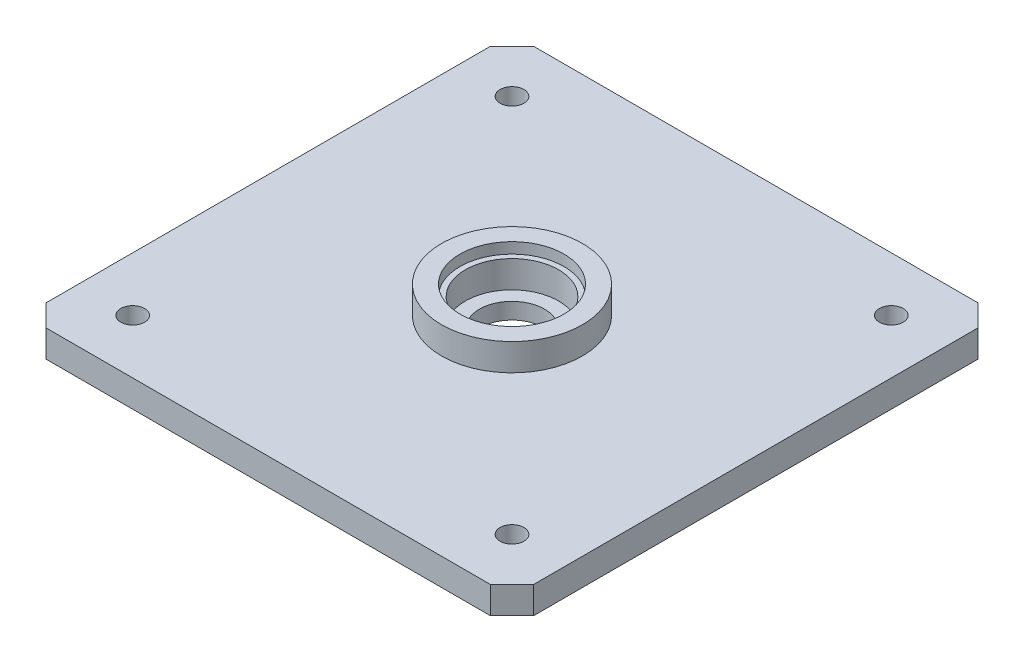
ISO-10303-21;
HEADER;
FILE_DESCRIPTION(('STEP AP214'),'2;1');
FILE_NAME('part.step','',(''),(''),'','','');
FILE_SCHEMA(('AUTOMOTIVE_DESIGN { 1 0 10303 214 1 1 1 1 }'));
ENDSEC;
DATA;
#1=APPLICATION_CONTEXT('core data for automotive mechanical design processes');
#2=APPLICATION_PROTOCOL_DEFINITION('international standard','automotive_design',2000,#1);
#3=PRODUCT_CONTEXT('',#1,'mechanical');
#4=PRODUCT('Part','Part','',(#3));
#5=PRODUCT_RELATED_PRODUCT_CATEGORY('part','',(#4));
#6=PRODUCT_DEFINITION_FORMATION('','',#4);
#7=PRODUCT_DEFINITION_CONTEXT('part definition',#1,'design');
#8=PRODUCT_DEFINITION('design','',#6,#7);
#9=PRODUCT_DEFINITION_SHAPE('','',#8);
#10=(LENGTH_UNIT() NAMED_UNIT(*) SI_UNIT(.MILLI.,.METRE.));
#11=(NAMED_UNIT(*) PLANE_ANGLE_UNIT() SI_UNIT($,.RADIAN.));
#12=(NAMED_UNIT(*) SI_UNIT($,.STERADIAN.) SOLID_ANGLE_UNIT());
#13=UNCERTAINTY_MEASURE_WITH_UNIT(LENGTH_MEASURE(1.E-05),#10,'distance_accuracy_value','');
#14=(GEOMETRIC_REPRESENTATION_CONTEXT(3) GLOBAL_UNCERTAINTY_ASSIGNED_CONTEXT((#13)) GLOBAL_UNIT_ASSIGNED_CONTEXT((#10,
#11,#12)) REPRESENTATION_CONTEXT('',''));
#15=CARTESIAN_POINT('',(0.,0.,0.));
#16=DIRECTION('',(0.,0.,1.));
#17=DIRECTION('',(1.,0.,0.));
#18=AXIS2_PLACEMENT_3D('',#15,#16,#17);
#19=CARTESIAN_POINT('',(0.,5.,45.));
#20=DIRECTION('',(0.,0.,-1.));
#21=DIRECTION('',(-1.,0.,0.));
#22=AXIS2_PLACEMENT_3D('',#19,#20,#21);
#23=PLANE('',#22);
#24=DIRECTION('',(1.,0.,0.));
#25=VECTOR('',#24,1.);
#26=CARTESIAN_POINT('',(0.,5.,45.));
#27=LINE('',#26,#25);
#28=CARTESIAN_POINT('',(-41.,5.,45.));
#29=VERTEX_POINT('',#28);
#30=CARTESIAN_POINT('',(41.,5.,45.));
#31=VERTEX_POINT('',#30);
#32=EDGE_CURVE('E165',#29,#31,#27,.T.);
#33=ORIENTED_EDGE('',*,*,#32,.F.);
#34=DIRECTION('',(0.,-1.,0.));
#35=VECTOR('',#34,1.);
#36=CARTESIAN_POINT('',(-41.,0.,45.));
#37=LINE('',#36,#35);
#38=CARTESIAN_POINT('',(-41.,0.,45.));
#39=VERTEX_POINT('',#38);
#40=EDGE_CURVE('E11',#29,#39,#37,.T.);
#41=ORIENTED_EDGE('',*,*,#40,.T.);
#42=DIRECTION('',(1.,0.,0.));
#43=VECTOR('',#42,1.);
#44=CARTESIAN_POINT('',(0.,0.,45.));
#45=LINE('',#44,#43);
#46=CARTESIAN_POINT('',(41.,0.,45.));
#47=VERTEX_POINT('',#46);
#48=EDGE_CURVE('E115',#39,#47,#45,.T.);
#49=ORIENTED_EDGE('',*,*,#48,.T.);
#50=DIRECTION('',(0.,1.,0.));
#51=VECTOR('',#50,1.);
#52=CARTESIAN_POINT('',(41.,5.,45.));
#53=LINE('',#52,#51);
#54=EDGE_CURVE('E50',#47,#31,#53,.T.);
#55=ORIENTED_EDGE('',*,*,#54,.T.);
#56=EDGE_LOOP('',(#33,#41,#49,#55));
#57=FACE_BOUND('',#56,.T.);
#58=ADVANCED_FACE('F41',(#57),#23,.F.);
#59=CARTESIAN_POINT('',(45.,5.,0.));
#60=DIRECTION('',(-1.,0.,0.));
#61=DIRECTION('',(0.,0.,1.));
#62=AXIS2_PLACEMENT_3D('',#59,#60,#61);
#63=PLANE('',#62);
#64=DIRECTION('',(0.,0.,-1.));
#65=VECTOR('',#64,1.);
#66=CARTESIAN_POINT('',(45.,0.,0.));
#67=LINE('',#66,#65);
#68=CARTESIAN_POINT('',(45.,0.,41.));
#69=VERTEX_POINT('',#68);
#70=CARTESIAN_POINT('',(45.,0.,-41.));
#71=VERTEX_POINT('',#70);
#72=EDGE_CURVE('E175',#69,#71,#67,.T.);
#73=ORIENTED_EDGE('',*,*,#72,.T.);
#74=DIRECTION('',(0.,1.,0.));
#75=VECTOR('',#74,1.);
#76=CARTESIAN_POINT('',(45.,5.,-41.));
#77=LINE('',#76,#75);
#78=CARTESIAN_POINT('',(45.,5.,-41.));
#79=VERTEX_POINT('',#78);
#80=EDGE_CURVE('E57',#71,#79,#77,.T.);
#81=ORIENTED_EDGE('',*,*,#80,.T.);
#82=DIRECTION('',(0.,0.,-1.));
#83=VECTOR('',#82,1.);
#84=CARTESIAN_POINT('',(45.,5.,0.));
#85=LINE('',#84,#83);
#86=CARTESIAN_POINT('',(45.,5.,41.));
#87=VERTEX_POINT('',#86);
#88=EDGE_CURVE('E169',#87,#79,#85,.T.);
#89=ORIENTED_EDGE('',*,*,#88,.F.);
#90=DIRECTION('',(0.,-1.,0.));
#91=VECTOR('',#90,1.);
#92=CARTESIAN_POINT('',(45.,5.,41.));
#93=LINE('',#92,#91);
#94=EDGE_CURVE('E159',#87,#69,#93,.T.);
#95=ORIENTED_EDGE('',*,*,#94,.T.);
#96=EDGE_LOOP('',(#73,#81,#89,#95));
#97=FACE_BOUND('',#96,.T.);
#98=ADVANCED_FACE('F174',(#97),#63,.F.);
#99=CARTESIAN_POINT('',(0.,5.,-45.));
#100=DIRECTION('',(0.,0.,-1.));
#101=DIRECTION('',(-1.,0.,0.));
#102=AXIS2_PLACEMENT_3D('',#99,#100,#101);
#103=PLANE('',#102);
#104=DIRECTION('',(1.,0.,0.));
#105=VECTOR('',#104,1.);
#106=CARTESIAN_POINT('',(0.,0.,-45.));
#107=LINE('',#106,#105);
#108=CARTESIAN_POINT('',(-41.,0.,-45.));
#109=VERTEX_POINT('',#108);
#110=CARTESIAN_POINT('',(41.,0.,-45.));
#111=VERTEX_POINT('',#110);
#112=EDGE_CURVE('E131',#109,#111,#107,.T.);
#113=ORIENTED_EDGE('',*,*,#112,.F.);
#114=DIRECTION('',(0.,1.,0.));
#115=VECTOR('',#114,1.);
#116=CARTESIAN_POINT('',(-41.,5.,-45.));
#117=LINE('',#116,#115);
#118=CARTESIAN_POINT('',(-41.,5.,-45.));
#119=VERTEX_POINT('',#118);
#120=EDGE_CURVE('E151',#109,#119,#117,.T.);
#121=ORIENTED_EDGE('',*,*,#120,.T.);
#122=DIRECTION('',(1.,0.,0.));
#123=VECTOR('',#122,1.);
#124=CARTESIAN_POINT('',(0.,5.,-45.));
#125=LINE('',#124,#123);
#126=CARTESIAN_POINT('',(41.,5.,-45.));
#127=VERTEX_POINT('',#126);
#128=EDGE_CURVE('E186',#119,#127,#125,.T.);
#129=ORIENTED_EDGE('',*,*,#128,.T.);
#130=DIRECTION('',(0.,-1.,0.));
#131=VECTOR('',#130,1.);
#132=CARTESIAN_POINT('',(41.,0.,-45.));
#133=LINE('',#132,#131);
#134=EDGE_CURVE('E148',#127,#111,#133,.T.);
#135=ORIENTED_EDGE('',*,*,#134,.T.);
#136=EDGE_LOOP('',(#113,#121,#129,#135));
#137=FACE_BOUND('',#136,.T.);
#138=ADVANCED_FACE('F208',(#137),#103,.T.);
#139=CARTESIAN_POINT('',(-35.,5.,-35.));
#140=DIRECTION('',(0.,-1.,0.));
#141=DIRECTION('',(0.,0.,-1.));
#142=AXIS2_PLACEMENT_3D('',#139,#140,#141);
#143=CYLINDRICAL_SURFACE('',#142,2.2);
#144=CARTESIAN_POINT('',(-35.,5.,-35.));
#145=DIRECTION('',(0.,1.,0.));
#146=DIRECTION('',(0.,0.,1.));
#147=AXIS2_PLACEMENT_3D('',#144,#145,#146);
#148=CIRCLE('',#147,2.2);
#149=CARTESIAN_POINT('',(-35.,5.,-32.8));
#150=VERTEX_POINT('',#149);
#151=EDGE_CURVE('E297',#150,#150,#148,.T.);
#152=ORIENTED_EDGE('',*,*,#151,.T.);
#153=EDGE_LOOP('',(#152));
#154=FACE_BOUND('',#153,.T.);
#155=CARTESIAN_POINT('',(-35.,0.,-35.));
#156=DIRECTION('',(0.,1.,0.));
#157=DIRECTION('',(0.,0.,1.));
#158=AXIS2_PLACEMENT_3D('',#155,#156,#157);
#159=CIRCLE('',#158,2.2);
#160=CARTESIAN_POINT('',(-35.,0.,-32.8));
#161=VERTEX_POINT('',#160);
#162=EDGE_CURVE('E179',#161,#161,#159,.T.);
#163=ORIENTED_EDGE('',*,*,#162,.F.);
#164=EDGE_LOOP('',(#163));
#165=FACE_BOUND('',#164,.T.);
#166=ADVANCED_FACE('F205',(#154,#165),#143,.F.);
#167=CARTESIAN_POINT('',(35.,5.,-35.));
#168=DIRECTION('',(0.,-1.,0.));
#169=DIRECTION('',(0.,0.,-1.));
#170=AXIS2_PLACEMENT_3D('',#167,#168,#169);
#171=CYLINDRICAL_SURFACE('',#170,2.19999999999999);
#172=CARTESIAN_POINT('',(35.,5.,-35.));
#173=DIRECTION('',(0.,1.,0.));
#174=DIRECTION('',(0.,0.,1.));
#175=AXIS2_PLACEMENT_3D('',#172,#173,#174);
#176=CIRCLE('',#175,2.19999999999999);
#177=CARTESIAN_POINT('',(35.,5.,-32.8));
#178=VERTEX_POINT('',#177);
#179=EDGE_CURVE('E294',#178,#178,#176,.T.);
#180=ORIENTED_EDGE('',*,*,#179,.T.);
#181=EDGE_LOOP('',(#180));
#182=FACE_BOUND('',#181,.T.);
#183=CARTESIAN_POINT('',(35.,0.,-35.));
#184=DIRECTION('',(0.,1.,0.));
#185=DIRECTION('',(0.,0.,1.));
#186=AXIS2_PLACEMENT_3D('',#183,#184,#185);
#187=CIRCLE('',#186,2.19999999999999);
#188=CARTESIAN_POINT('',(35.,0.,-32.8));
#189=VERTEX_POINT('',#188);
#190=EDGE_CURVE('E199',#189,#189,#187,.T.);
#191=ORIENTED_EDGE('',*,*,#190,.F.);
#192=EDGE_LOOP('',(#191));
#193=FACE_BOUND('',#192,.T.);
#194=ADVANCED_FACE('F207',(#182,#193),#171,.F.);
#195=CARTESIAN_POINT('',(35.,5.,35.));
#196=DIRECTION('',(0.,-1.,0.));
#197=DIRECTION('',(0.,0.,-1.));
#198=AXIS2_PLACEMENT_3D('',#195,#196,#197);
#199=CYLINDRICAL_SURFACE('',#198,2.2);
#200=CARTESIAN_POINT('',(35.,5.,35.));
#201=DIRECTION('',(0.,1.,0.));
#202=DIRECTION('',(0.,0.,1.));
#203=AXIS2_PLACEMENT_3D('',#200,#201,#202);
#204=CIRCLE('',#203,2.2);
#205=CARTESIAN_POINT('',(35.,5.,37.2));
#206=VERTEX_POINT('',#205);
#207=EDGE_CURVE('E291',#206,#206,#204,.T.);
#208=ORIENTED_EDGE('',*,*,#207,.T.);
#209=EDGE_LOOP('',(#208));
#210=FACE_BOUND('',#209,.T.);
#211=CARTESIAN_POINT('',(35.,0.,35.));
#212=DIRECTION('',(0.,1.,0.));
#213=DIRECTION('',(0.,0.,1.));
#214=AXIS2_PLACEMENT_3D('',#211,#212,#213);
#215=CIRCLE('',#214,2.2);
#216=CARTESIAN_POINT('',(35.,0.,37.2));
#217=VERTEX_POINT('',#216);
#218=EDGE_CURVE('E195',#217,#217,#215,.T.);
#219=ORIENTED_EDGE('',*,*,#218,.F.);
#220=EDGE_LOOP('',(#219));
#221=FACE_BOUND('',#220,.T.);
#222=ADVANCED_FACE('F215',(#210,#221),#199,.F.);
#223=CARTESIAN_POINT('',(-35.,5.,35.));
#224=DIRECTION('',(0.,-1.,0.));
#225=DIRECTION('',(0.,0.,-1.));
#226=AXIS2_PLACEMENT_3D('',#223,#224,#225);
#227=CYLINDRICAL_SURFACE('',#226,2.2);
#228=CARTESIAN_POINT('',(-35.,5.,35.));
#229=DIRECTION('',(0.,1.,0.));
#230=DIRECTION('',(0.,0.,1.));
#231=AXIS2_PLACEMENT_3D('',#228,#229,#230);
#232=CIRCLE('',#231,2.2);
#233=CARTESIAN_POINT('',(-35.,5.,37.2));
#234=VERTEX_POINT('',#233);
#235=EDGE_CURVE('E130',#234,#234,#232,.T.);
#236=ORIENTED_EDGE('',*,*,#235,.T.);
#237=EDGE_LOOP('',(#236));
#238=FACE_BOUND('',#237,.T.);
#239=CARTESIAN_POINT('',(-35.,0.,35.));
#240=DIRECTION('',(0.,1.,0.));
#241=DIRECTION('',(0.,0.,1.));
#242=AXIS2_PLACEMENT_3D('',#239,#240,#241);
#243=CIRCLE('',#242,2.2);
#244=CARTESIAN_POINT('',(-35.,0.,37.2));
#245=VERTEX_POINT('',#244);
#246=EDGE_CURVE('E192',#245,#245,#243,.T.);
#247=ORIENTED_EDGE('',*,*,#246,.F.);
#248=EDGE_LOOP('',(#247));
#249=FACE_BOUND('',#248,.T.);
#250=ADVANCED_FACE('F230',(#238,#249),#227,.F.);
#251=CARTESIAN_POINT('',(-45.,5.,0.));
#252=DIRECTION('',(-1.,0.,0.));
#253=DIRECTION('',(0.,0.,1.));
#254=AXIS2_PLACEMENT_3D('',#251,#252,#253);
#255=PLANE('',#254);
#256=DIRECTION('',(0.,0.,-1.));
#257=VECTOR('',#256,1.);
#258=CARTESIAN_POINT('',(-45.,5.,0.));
#259=LINE('',#258,#257);
#260=CARTESIAN_POINT('',(-45.,5.,41.));
#261=VERTEX_POINT('',#260);
#262=CARTESIAN_POINT('',(-45.,5.,-41.));
#263=VERTEX_POINT('',#262);
#264=EDGE_CURVE('E183',#261,#263,#259,.T.);
#265=ORIENTED_EDGE('',*,*,#264,.T.);
#266=DIRECTION('',(0.,-1.,0.));
#267=VECTOR('',#266,1.);
#268=CARTESIAN_POINT('',(-45.,5.,-41.));
#269=LINE('',#268,#267);
#270=CARTESIAN_POINT('',(-45.,0.,-41.));
#271=VERTEX_POINT('',#270);
#272=EDGE_CURVE('E129',#263,#271,#269,.T.);
#273=ORIENTED_EDGE('',*,*,#272,.T.);
#274=DIRECTION('',(0.,0.,-1.));
#275=VECTOR('',#274,1.);
#276=CARTESIAN_POINT('',(-45.,0.,0.));
#277=LINE('',#276,#275);
#278=CARTESIAN_POINT('',(-45.,0.,41.));
#279=VERTEX_POINT('',#278);
#280=EDGE_CURVE('E113',#279,#271,#277,.T.);
#281=ORIENTED_EDGE('',*,*,#280,.F.);
#282=DIRECTION('',(0.,1.,0.));
#283=VECTOR('',#282,1.);
#284=CARTESIAN_POINT('',(-45.,5.,41.));
#285=LINE('',#284,#283);
#286=EDGE_CURVE('E126',#279,#261,#285,.T.);
#287=ORIENTED_EDGE('',*,*,#286,.T.);
#288=EDGE_LOOP('',(#265,#273,#281,#287));
#289=FACE_BOUND('',#288,.T.);
#290=ADVANCED_FACE('F125',(#289),#255,.T.);
#291=CARTESIAN_POINT('',(0.,5.,0.));
#292=DIRECTION('',(0.,1.,0.));
#293=DIRECTION('',(0.,0.,1.));
#294=AXIS2_PLACEMENT_3D('',#291,#292,#293);
#295=PLANE('',#294);
#296=ORIENTED_EDGE('',*,*,#235,.F.);
#297=EDGE_LOOP('',(#296));
#298=FACE_BOUND('',#297,.T.);
#299=ORIENTED_EDGE('',*,*,#207,.F.);
#300=EDGE_LOOP('',(#299));
#301=FACE_BOUND('',#300,.T.);
#302=ORIENTED_EDGE('',*,*,#179,.F.);
#303=EDGE_LOOP('',(#302));
#304=FACE_BOUND('',#303,.T.);
#305=ORIENTED_EDGE('',*,*,#151,.F.);
#306=EDGE_LOOP('',(#305));
#307=FACE_BOUND('',#306,.T.);
#308=CARTESIAN_POINT('',(0.,5.,0.));
#309=DIRECTION('',(0.,1.,0.));
#310=DIRECTION('',(0.,0.,1.));
#311=AXIS2_PLACEMENT_3D('',#308,#309,#310);
#312=CIRCLE('',#311,13.);
#313=CARTESIAN_POINT('',(0.,5.,13.));
#314=VERTEX_POINT('',#313);
#315=EDGE_CURVE('E170',#314,#314,#312,.T.);
#316=ORIENTED_EDGE('',*,*,#315,.F.);
#317=EDGE_LOOP('',(#316));
#318=FACE_BOUND('',#317,.T.);
#319=ORIENTED_EDGE('',*,*,#128,.F.);
#320=DIRECTION('',(0.707106781186548,0.,-0.707106781186548));
#321=VECTOR('',#320,1.);
#322=CARTESIAN_POINT('',(-43.,5.,-43.));
#323=LINE('',#322,#321);
#324=EDGE_CURVE('E157',#119,#263,#323,.F.);
#325=ORIENTED_EDGE('',*,*,#324,.T.);
#326=ORIENTED_EDGE('',*,*,#264,.F.);
#327=DIRECTION('',(0.707106781186548,0.,0.707106781186548));
#328=VECTOR('',#327,1.);
#329=CARTESIAN_POINT('',(-43.,5.,43.));
#330=LINE('',#329,#328);
#331=EDGE_CURVE('E135',#261,#29,#330,.T.);
#332=ORIENTED_EDGE('',*,*,#331,.T.);
#333=ORIENTED_EDGE('',*,*,#32,.T.);
#334=DIRECTION('',(-0.707106781186548,0.,0.707106781186548));
#335=VECTOR('',#334,1.);
#336=CARTESIAN_POINT('',(43.,5.,43.));
#337=LINE('',#336,#335);
#338=EDGE_CURVE('E64',#31,#87,#337,.F.);
#339=ORIENTED_EDGE('',*,*,#338,.T.);
#340=ORIENTED_EDGE('',*,*,#88,.T.);
#341=DIRECTION('',(-0.707106781186548,0.,-0.707106781186548));
#342=VECTOR('',#341,1.);
#343=CARTESIAN_POINT('',(43.,5.,-43.));
#344=LINE('',#343,#342);
#345=EDGE_CURVE('E155',#79,#127,#344,.T.);
#346=ORIENTED_EDGE('',*,*,#345,.T.);
#347=EDGE_LOOP('',(#319,#325,#326,#332,#333,#339,#340,#346));
#348=FACE_BOUND('',#347,.T.);
#349=ADVANCED_FACE('F168',(#298,#301,#304,#307,#318,#348),#295,.T.);
#350=CARTESIAN_POINT('',(0.,0.,0.));
#351=DIRECTION('',(0.,1.,0.));
#352=DIRECTION('',(0.,0.,1.));
#353=AXIS2_PLACEMENT_3D('',#350,#351,#352);
#354=PLANE('',#353);
#355=ORIENTED_EDGE('',*,*,#246,.T.);
#356=EDGE_LOOP('',(#355));
#357=FACE_BOUND('',#356,.T.);
#358=ORIENTED_EDGE('',*,*,#218,.T.);
#359=EDGE_LOOP('',(#358));
#360=FACE_BOUND('',#359,.T.);
#361=ORIENTED_EDGE('',*,*,#190,.T.);
#362=EDGE_LOOP('',(#361));
#363=FACE_BOUND('',#362,.T.);
#364=ORIENTED_EDGE('',*,*,#162,.T.);
#365=EDGE_LOOP('',(#364));
#366=FACE_BOUND('',#365,.T.);
#367=ORIENTED_EDGE('',*,*,#280,.T.);
#368=DIRECTION('',(-0.707106781186548,0.,0.707106781186548));
#369=VECTOR('',#368,1.);
#370=CARTESIAN_POINT('',(-45.,0.,-41.));
#371=LINE('',#370,#369);
#372=EDGE_CURVE('E146',#271,#109,#371,.F.);
#373=ORIENTED_EDGE('',*,*,#372,.T.);
#374=ORIENTED_EDGE('',*,*,#112,.T.);
#375=DIRECTION('',(0.707106781186548,0.,0.707106781186548));
#376=VECTOR('',#375,1.);
#377=CARTESIAN_POINT('',(41.,0.,-45.));
#378=LINE('',#377,#376);
#379=EDGE_CURVE('E119',#111,#71,#378,.T.);
#380=ORIENTED_EDGE('',*,*,#379,.T.);
#381=ORIENTED_EDGE('',*,*,#72,.F.);
#382=DIRECTION('',(0.707106781186548,0.,-0.707106781186548));
#383=VECTOR('',#382,1.);
#384=CARTESIAN_POINT('',(45.,0.,41.));
#385=LINE('',#384,#383);
#386=EDGE_CURVE('E120',#69,#47,#385,.F.);
#387=ORIENTED_EDGE('',*,*,#386,.T.);
#388=ORIENTED_EDGE('',*,*,#48,.F.);
#389=DIRECTION('',(-0.707106781186548,0.,-0.707106781186548));
#390=VECTOR('',#389,1.);
#391=CARTESIAN_POINT('',(-41.,0.,45.));
#392=LINE('',#391,#390);
#393=EDGE_CURVE('E109',#39,#279,#392,.T.);
#394=ORIENTED_EDGE('',*,*,#393,.T.);
#395=EDGE_LOOP('',(#367,#373,#374,#380,#381,#387,#388,#394));
#396=FACE_BOUND('',#395,.T.);
#397=CARTESIAN_POINT('',(0.,0.,0.));
#398=DIRECTION('',(0.,1.,0.));
#399=DIRECTION('',(0.,0.,1.));
#400=AXIS2_PLACEMENT_3D('',#397,#398,#399);
#401=CIRCLE('',#400,6.);
#402=CARTESIAN_POINT('',(0.,0.,6.00000000000001));
#403=VERTEX_POINT('',#402);
#404=EDGE_CURVE('E281',#403,#403,#401,.T.);
#405=ORIENTED_EDGE('',*,*,#404,.T.);
#406=EDGE_LOOP('',(#405));
#407=FACE_BOUND('',#406,.T.);
#408=ADVANCED_FACE('F111',(#357,#360,#363,#366,#396,#407),#354,.F.);
#409=CARTESIAN_POINT('',(0.,3.,0.));
#410=DIRECTION('',(0.,-1.,0.));
#411=DIRECTION('',(0.,0.,-1.));
#412=AXIS2_PLACEMENT_3D('',#409,#410,#411);
#413=CYLINDRICAL_SURFACE('',#412,6.);
#414=CARTESIAN_POINT('',(0.,3.,0.));
#415=DIRECTION('',(0.,1.,0.));
#416=DIRECTION('',(0.,0.,1.));
#417=AXIS2_PLACEMENT_3D('',#414,#415,#416);
#418=CIRCLE('',#417,6.);
#419=CARTESIAN_POINT('',(0.,3.,6.00000000000001));
#420=VERTEX_POINT('',#419);
#421=EDGE_CURVE('E196',#420,#420,#418,.T.);
#422=ORIENTED_EDGE('',*,*,#421,.T.);
#423=EDGE_LOOP('',(#422));
#424=FACE_BOUND('',#423,.T.);
#425=ORIENTED_EDGE('',*,*,#404,.F.);
#426=EDGE_LOOP('',(#425));
#427=FACE_BOUND('',#426,.T.);
#428=ADVANCED_FACE('F233',(#424,#427),#413,.F.);
#429=CARTESIAN_POINT('',(0.,3.,0.));
#430=DIRECTION('',(0.,1.,0.));
#431=DIRECTION('',(0.,0.,1.));
#432=AXIS2_PLACEMENT_3D('',#429,#430,#431);
#433=PLANE('',#432);
#434=CARTESIAN_POINT('',(0.,3.,0.));
#435=DIRECTION('',(0.,1.,0.));
#436=DIRECTION('',(0.,0.,1.));
#437=AXIS2_PLACEMENT_3D('',#434,#435,#436);
#438=CIRCLE('',#437,8.6);
#439=CARTESIAN_POINT('',(0.,3.,8.60000000000001));
#440=VERTEX_POINT('',#439);
#441=EDGE_CURVE('E140',#440,#440,#438,.F.);
#442=ORIENTED_EDGE('',*,*,#441,.F.);
#443=EDGE_LOOP('',(#442));
#444=FACE_BOUND('',#443,.T.);
#445=ORIENTED_EDGE('',*,*,#421,.F.);
#446=EDGE_LOOP('',(#445));
#447=FACE_BOUND('',#446,.T.);
#448=ADVANCED_FACE('F240',(#444,#447),#433,.T.);
#449=CARTESIAN_POINT('',(0.,8.,0.));
#450=DIRECTION('',(0.,-1.,0.));
#451=DIRECTION('',(0.,0.,-1.));
#452=AXIS2_PLACEMENT_3D('',#449,#450,#451);
#453=CYLINDRICAL_SURFACE('',#452,8.6);
#454=ORIENTED_EDGE('',*,*,#441,.T.);
#455=EDGE_LOOP('',(#454));
#456=FACE_BOUND('',#455,.T.);
#457=CARTESIAN_POINT('',(0.,8.,0.));
#458=DIRECTION('',(0.,1.,0.));
#459=DIRECTION('',(0.,0.,1.));
#460=AXIS2_PLACEMENT_3D('',#457,#458,#459);
#461=CIRCLE('',#460,8.6);
#462=CARTESIAN_POINT('',(0.,8.,8.60000000000001));
#463=VERTEX_POINT('',#462);
#464=EDGE_CURVE('E278',#463,#463,#461,.T.);
#465=ORIENTED_EDGE('',*,*,#464,.T.);
#466=EDGE_LOOP('',(#465));
#467=FACE_BOUND('',#466,.T.);
#468=ADVANCED_FACE('F244',(#456,#467),#453,.F.);
#469=CARTESIAN_POINT('',(0.,8.,0.));
#470=DIRECTION('',(0.,-1.,0.));
#471=DIRECTION('',(0.,0.,-1.));
#472=AXIS2_PLACEMENT_3D('',#469,#470,#471);
#473=CYLINDRICAL_SURFACE('',#472,13.);
#474=ORIENTED_EDGE('',*,*,#315,.T.);
#475=EDGE_LOOP('',(#474));
#476=FACE_BOUND('',#475,.T.);
#477=CARTESIAN_POINT('',(0.,10.,0.));
#478=DIRECTION('',(0.,1.,0.));
#479=DIRECTION('',(0.,0.,1.));
#480=AXIS2_PLACEMENT_3D('',#477,#478,#479);
#481=CIRCLE('',#480,13.);
#482=CARTESIAN_POINT('',(0.,10.,13.));
#483=VERTEX_POINT('',#482);
#484=EDGE_CURVE('E276',#483,#483,#481,.T.);
#485=ORIENTED_EDGE('',*,*,#484,.F.);
#486=EDGE_LOOP('',(#485));
#487=FACE_BOUND('',#486,.T.);
#488=ADVANCED_FACE('F248',(#476,#487),#473,.T.);
#489=CARTESIAN_POINT('',(0.,8.,0.));
#490=DIRECTION('',(0.,1.,0.));
#491=DIRECTION('',(0.,0.,1.));
#492=AXIS2_PLACEMENT_3D('',#489,#490,#491);
#493=PLANE('',#492);
#494=CARTESIAN_POINT('',(0.,8.,0.));
#495=DIRECTION('',(0.,1.,0.));
#496=DIRECTION('',(0.,0.,1.));
#497=AXIS2_PLACEMENT_3D('',#494,#495,#496);
#498=CIRCLE('',#497,9.6);
#499=CARTESIAN_POINT('',(0.,8.,9.60000000000001));
#500=VERTEX_POINT('',#499);
#501=EDGE_CURVE('E136',#500,#500,#498,.F.);
#502=ORIENTED_EDGE('',*,*,#501,.F.);
#503=EDGE_LOOP('',(#502));
#504=FACE_BOUND('',#503,.T.);
#505=ORIENTED_EDGE('',*,*,#464,.F.);
#506=EDGE_LOOP('',(#505));
#507=FACE_BOUND('',#506,.T.);
#508=ADVANCED_FACE('F251',(#504,#507),#493,.T.);
#509=CARTESIAN_POINT('',(0.,10.,0.));
#510=DIRECTION('',(0.,-1.,0.));
#511=DIRECTION('',(0.,0.,-1.));
#512=AXIS2_PLACEMENT_3D('',#509,#510,#511);
#513=CYLINDRICAL_SURFACE('',#512,9.6);
#514=ORIENTED_EDGE('',*,*,#501,.T.);
#515=EDGE_LOOP('',(#514));
#516=FACE_BOUND('',#515,.T.);
#517=CARTESIAN_POINT('',(0.,10.,0.));
#518=DIRECTION('',(0.,1.,0.));
#519=DIRECTION('',(0.,0.,1.));
#520=AXIS2_PLACEMENT_3D('',#517,#518,#519);
#521=CIRCLE('',#520,9.6);
#522=CARTESIAN_POINT('',(0.,10.,9.60000000000001));
#523=VERTEX_POINT('',#522);
#524=EDGE_CURVE('E273',#523,#523,#521,.T.);
#525=ORIENTED_EDGE('',*,*,#524,.T.);
#526=EDGE_LOOP('',(#525));
#527=FACE_BOUND('',#526,.T.);
#528=ADVANCED_FACE('F255',(#516,#527),#513,.F.);
#529=CARTESIAN_POINT('',(0.,10.,0.));
#530=DIRECTION('',(0.,1.,0.));
#531=DIRECTION('',(0.,0.,1.));
#532=AXIS2_PLACEMENT_3D('',#529,#530,#531);
#533=PLANE('',#532);
#534=ORIENTED_EDGE('',*,*,#524,.F.);
#535=EDGE_LOOP('',(#534));
#536=FACE_BOUND('',#535,.T.);
#537=ORIENTED_EDGE('',*,*,#484,.T.);
#538=EDGE_LOOP('',(#537));
#539=FACE_BOUND('',#538,.T.);
#540=ADVANCED_FACE('F259',(#536,#539),#533,.T.);
#541=CARTESIAN_POINT('',(-45.,5.,-41.));
#542=DIRECTION('',(0.707106781186547,0.,0.707106781186547));
#543=DIRECTION('',(0.,-1.,0.));
#544=AXIS2_PLACEMENT_3D('',#541,#542,#543);
#545=PLANE('',#544);
#546=ORIENTED_EDGE('',*,*,#324,.F.);
#547=ORIENTED_EDGE('',*,*,#120,.F.);
#548=ORIENTED_EDGE('',*,*,#372,.F.);
#549=ORIENTED_EDGE('',*,*,#272,.F.);
#550=EDGE_LOOP('',(#546,#547,#548,#549));
#551=FACE_BOUND('',#550,.T.);
#552=ADVANCED_FACE('F262',(#551),#545,.F.);
#553=CARTESIAN_POINT('',(41.,5.,-45.));
#554=DIRECTION('',(0.707106781186547,0.,-0.707106781186547));
#555=DIRECTION('',(0.,1.,0.));
#556=AXIS2_PLACEMENT_3D('',#553,#554,#555);
#557=PLANE('',#556);
#558=ORIENTED_EDGE('',*,*,#345,.F.);
#559=ORIENTED_EDGE('',*,*,#80,.F.);
#560=ORIENTED_EDGE('',*,*,#379,.F.);
#561=ORIENTED_EDGE('',*,*,#134,.F.);
#562=EDGE_LOOP('',(#558,#559,#560,#561));
#563=FACE_BOUND('',#562,.T.);
#564=ADVANCED_FACE('F267',(#563),#557,.T.);
#565=CARTESIAN_POINT('',(-41.,5.,45.));
#566=DIRECTION('',(-0.707106781186547,0.,0.707106781186547));
#567=DIRECTION('',(0.,1.,0.));
#568=AXIS2_PLACEMENT_3D('',#565,#566,#567);
#569=PLANE('',#568);
#570=ORIENTED_EDGE('',*,*,#331,.F.);
#571=ORIENTED_EDGE('',*,*,#286,.F.);
#572=ORIENTED_EDGE('',*,*,#393,.F.);
#573=ORIENTED_EDGE('',*,*,#40,.F.);
#574=EDGE_LOOP('',(#570,#571,#572,#573));
#575=FACE_BOUND('',#574,.T.);
#576=ADVANCED_FACE('F134',(#575),#569,.T.);
#577=CARTESIAN_POINT('',(45.,5.,41.));
#578=DIRECTION('',(-0.707106781186547,0.,-0.707106781186547));
#579=DIRECTION('',(0.,-1.,0.));
#580=AXIS2_PLACEMENT_3D('',#577,#578,#579);
#581=PLANE('',#580);
#582=ORIENTED_EDGE('',*,*,#338,.F.);
#583=ORIENTED_EDGE('',*,*,#54,.F.);
#584=ORIENTED_EDGE('',*,*,#386,.F.);
#585=ORIENTED_EDGE('',*,*,#94,.F.);
#586=EDGE_LOOP('',(#582,#583,#584,#585));
#587=FACE_BOUND('',#586,.T.);
#588=ADVANCED_FACE('F44',(#587),#581,.F.);
#589=CLOSED_SHELL('',(#58,#98,#138,#166,#194,#222,#250,#290,#349,#408,#428,#448,#468,#488,#508,
#528,#540,#552,#564,#576,#588));
#590=MANIFOLD_SOLID_BREP('B2',#589);
#591=ADVANCED_BREP_SHAPE_REPRESENTATION('',(#18,#590),#14);
#592=SHAPE_DEFINITION_REPRESENTATION(#9,#591);
ENDSEC;
END-ISO-10303-21;
